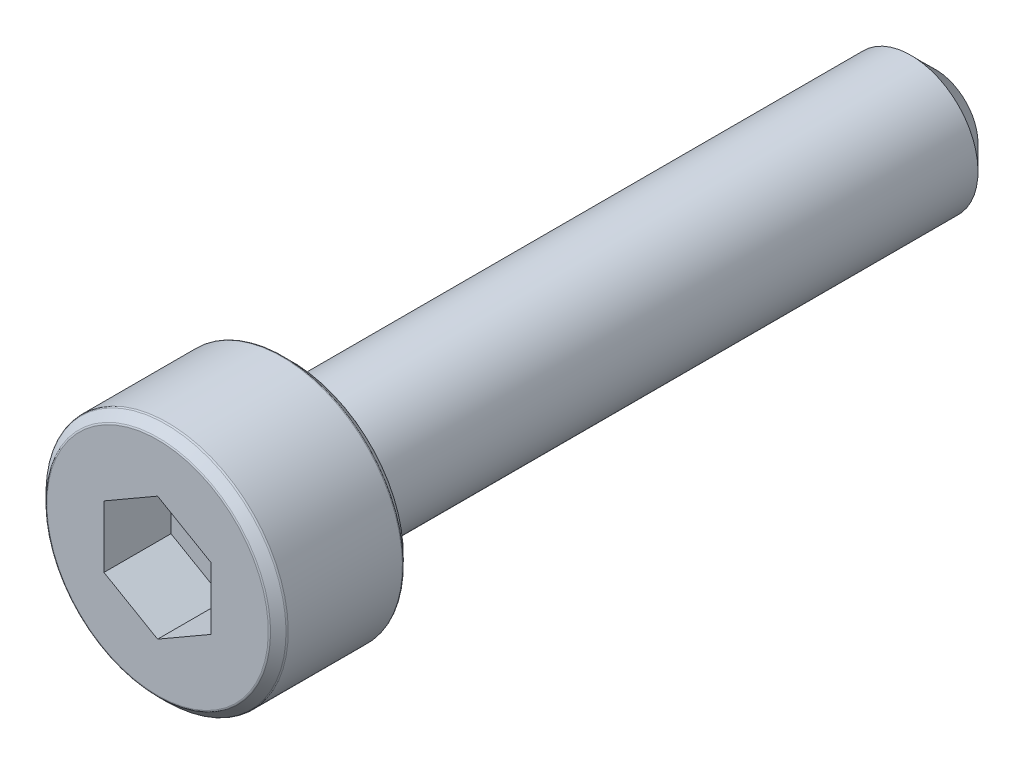
ISO-10303-21;
HEADER;
FILE_DESCRIPTION(('STEP AP214'),'2;1');
FILE_NAME('part.step','',(''),(''),'','','');
FILE_SCHEMA(('AUTOMOTIVE_DESIGN { 1 0 10303 214 1 1 1 1 }'));
ENDSEC;
DATA;
#1=APPLICATION_CONTEXT('core data for automotive mechanical design processes');
#2=APPLICATION_PROTOCOL_DEFINITION('international standard','automotive_design',2000,#1);
#3=PRODUCT_CONTEXT('',#1,'mechanical');
#4=PRODUCT('Part','Part','',(#3));
#5=PRODUCT_RELATED_PRODUCT_CATEGORY('part','',(#4));
#6=PRODUCT_DEFINITION_FORMATION('','',#4);
#7=PRODUCT_DEFINITION_CONTEXT('part definition',#1,'design');
#8=PRODUCT_DEFINITION('design','',#6,#7);
#9=PRODUCT_DEFINITION_SHAPE('','',#8);
#10=(LENGTH_UNIT() NAMED_UNIT(*) SI_UNIT(.MILLI.,.METRE.));
#11=(NAMED_UNIT(*) PLANE_ANGLE_UNIT() SI_UNIT($,.RADIAN.));
#12=(NAMED_UNIT(*) SI_UNIT($,.STERADIAN.) SOLID_ANGLE_UNIT());
#13=UNCERTAINTY_MEASURE_WITH_UNIT(LENGTH_MEASURE(1.E-05),#10,'distance_accuracy_value','');
#14=(GEOMETRIC_REPRESENTATION_CONTEXT(3) GLOBAL_UNCERTAINTY_ASSIGNED_CONTEXT((#13)) GLOBAL_UNIT_ASSIGNED_CONTEXT((#10,
#11,#12)) REPRESENTATION_CONTEXT('',''));
#15=CARTESIAN_POINT('',(0.,0.,0.));
#16=DIRECTION('',(0.,0.,1.));
#17=DIRECTION('',(1.,0.,0.));
#18=AXIS2_PLACEMENT_3D('',#15,#16,#17);
#19=CARTESIAN_POINT('',(0.,2.06377536533739,7.25));
#20=DIRECTION('',(0.,0.,-1.));
#21=DIRECTION('',(0.,1.,0.));
#22=AXIS2_PLACEMENT_3D('',#19,#20,#21);
#23=PLANE('',#22);
#24=DIRECTION('',(-0.866025403784439,-0.5,0.));
#25=VECTOR('',#24,1.);
#26=CARTESIAN_POINT('',(0.,1.15470053837925,7.25));
#27=LINE('',#26,#25);
#28=CARTESIAN_POINT('',(0.,1.15470053837925,7.25));
#29=VERTEX_POINT('',#28);
#30=CARTESIAN_POINT('',(-0.999999999999996,0.577350269189628,7.25));
#31=VERTEX_POINT('',#30);
#32=EDGE_CURVE('E53',#29,#31,#27,.T.);
#33=ORIENTED_EDGE('',*,*,#32,.F.);
#34=DIRECTION('',(-0.866025403784439,0.5,0.));
#35=VECTOR('',#34,1.);
#36=CARTESIAN_POINT('',(0.999999999999996,0.577350269189628,7.25));
#37=LINE('',#36,#35);
#38=CARTESIAN_POINT('',(0.999999999999996,0.577350269189628,7.25));
#39=VERTEX_POINT('',#38);
#40=EDGE_CURVE('E83',#39,#29,#37,.T.);
#41=ORIENTED_EDGE('',*,*,#40,.F.);
#42=DIRECTION('',(0.,1.,0.));
#43=VECTOR('',#42,1.);
#44=CARTESIAN_POINT('',(0.999999999999996,-0.57735026918962,7.25));
#45=LINE('',#44,#43);
#46=CARTESIAN_POINT('',(0.999999999999996,-0.57735026918962,7.25));
#47=VERTEX_POINT('',#46);
#48=EDGE_CURVE('E408',#47,#39,#45,.T.);
#49=ORIENTED_EDGE('',*,*,#48,.F.);
#50=DIRECTION('',(0.866025403784439,0.5,0.));
#51=VECTOR('',#50,1.);
#52=CARTESIAN_POINT('',(0.,-1.15470053837924,7.25));
#53=LINE('',#52,#51);
#54=CARTESIAN_POINT('',(0.,-1.15470053837924,7.25));
#55=VERTEX_POINT('',#54);
#56=EDGE_CURVE('E415',#55,#47,#53,.T.);
#57=ORIENTED_EDGE('',*,*,#56,.F.);
#58=DIRECTION('',(0.866025403784439,-0.5,0.));
#59=VECTOR('',#58,1.);
#60=CARTESIAN_POINT('',(-0.999999999999995,-0.57735026918962,7.25));
#61=LINE('',#60,#59);
#62=CARTESIAN_POINT('',(-0.999999999999995,-0.57735026918962,7.25));
#63=VERTEX_POINT('',#62);
#64=EDGE_CURVE('E122',#63,#55,#61,.T.);
#65=ORIENTED_EDGE('',*,*,#64,.F.);
#66=DIRECTION('',(0.,-1.,0.));
#67=VECTOR('',#66,1.);
#68=CARTESIAN_POINT('',(-0.999999999999996,0.577350269189628,7.25));
#69=LINE('',#68,#67);
#70=EDGE_CURVE('E403',#31,#63,#69,.T.);
#71=ORIENTED_EDGE('',*,*,#70,.F.);
#72=EDGE_LOOP('',(#33,#41,#49,#57,#65,#71));
#73=FACE_BOUND('',#72,.T.);
#74=CARTESIAN_POINT('',(0.,0.,7.25));
#75=DIRECTION('',(0.,0.,1.));
#76=DIRECTION('',(0.,-1.,0.));
#77=AXIS2_PLACEMENT_3D('',#74,#75,#76);
#78=CIRCLE('',#77,2.06377536533738);
#79=CARTESIAN_POINT('',(0.,-2.06377536533738,7.25));
#80=VERTEX_POINT('',#79);
#81=EDGE_CURVE('E11',#80,#80,#78,.T.);
#82=ORIENTED_EDGE('',*,*,#81,.T.);
#83=EDGE_LOOP('',(#82));
#84=FACE_BOUND('',#83,.T.);
#85=ADVANCED_FACE('F39',(#73,#84),#23,.F.);
#86=CARTESIAN_POINT('',(0.,0.,7.2078125));
#87=DIRECTION('',(0.,0.,1.));
#88=DIRECTION('',(0.,-1.,0.));
#89=AXIS2_PLACEMENT_3D('',#86,#87,#88);
#90=TOROIDAL_SURFACE('',#89,2.06377536533738,0.0421874999999995);
#91=ORIENTED_EDGE('',*,*,#81,.F.);
#92=EDGE_LOOP('',(#91));
#93=FACE_BOUND('',#92,.T.);
#94=CARTESIAN_POINT('',(0.,0.,7.23764356733131));
#95=DIRECTION('',(0.,0.,1.));
#96=DIRECTION('',(0.,-1.,0.));
#97=AXIS2_PLACEMENT_3D('',#94,#95,#96);
#98=CIRCLE('',#97,2.09360643266869);
#99=CARTESIAN_POINT('',(0.,-2.09360643266869,7.23764356733131));
#100=VERTEX_POINT('',#99);
#101=EDGE_CURVE('E46',#100,#100,#98,.T.);
#102=ORIENTED_EDGE('',*,*,#101,.T.);
#103=EDGE_LOOP('',(#102));
#104=FACE_BOUND('',#103,.T.);
#105=ADVANCED_FACE('F164',(#93,#104),#90,.T.);
#106=CARTESIAN_POINT('',(0.,0.,7.09360643266869));
#107=DIRECTION('',(0.,0.,-1.));
#108=DIRECTION('',(0.,1.,0.));
#109=AXIS2_PLACEMENT_3D('',#106,#107,#108);
#110=CONICAL_SURFACE('',#109,2.23764356733131,0.785398163397448);
#111=ORIENTED_EDGE('',*,*,#101,.F.);
#112=EDGE_LOOP('',(#111));
#113=FACE_BOUND('',#112,.T.);
#114=CARTESIAN_POINT('',(0.,0.,7.09360643266869));
#115=DIRECTION('',(0.,0.,1.));
#116=DIRECTION('',(0.,-1.,0.));
#117=AXIS2_PLACEMENT_3D('',#114,#115,#116);
#118=CIRCLE('',#117,2.23764356733131);
#119=CARTESIAN_POINT('',(0.,-2.23764356733131,7.09360643266869));
#120=VERTEX_POINT('',#119);
#121=EDGE_CURVE('E159',#120,#120,#118,.T.);
#122=ORIENTED_EDGE('',*,*,#121,.T.);
#123=EDGE_LOOP('',(#122));
#124=FACE_BOUND('',#123,.T.);
#125=ADVANCED_FACE('F166',(#113,#124),#110,.T.);
#126=CARTESIAN_POINT('',(0.,0.,7.06377536533738));
#127=DIRECTION('',(0.,0.,1.));
#128=DIRECTION('',(0.,-1.,0.));
#129=AXIS2_PLACEMENT_3D('',#126,#127,#128);
#130=TOROIDAL_SURFACE('',#129,2.2078125,0.0421875);
#131=ORIENTED_EDGE('',*,*,#121,.F.);
#132=EDGE_LOOP('',(#131));
#133=FACE_BOUND('',#132,.T.);
#134=CARTESIAN_POINT('',(0.,0.,7.06377536533738));
#135=DIRECTION('',(0.,0.,1.));
#136=DIRECTION('',(0.,-1.,0.));
#137=AXIS2_PLACEMENT_3D('',#134,#135,#136);
#138=CIRCLE('',#137,2.25);
#139=CARTESIAN_POINT('',(0.,-2.25,7.06377536533738));
#140=VERTEX_POINT('',#139);
#141=EDGE_CURVE('E156',#140,#140,#138,.T.);
#142=ORIENTED_EDGE('',*,*,#141,.T.);
#143=EDGE_LOOP('',(#142));
#144=FACE_BOUND('',#143,.T.);
#145=ADVANCED_FACE('F169',(#133,#144),#130,.T.);
#146=CARTESIAN_POINT('',(0.,0.,7.25));
#147=DIRECTION('',(0.,0.,1.));
#148=DIRECTION('',(0.,-1.,0.));
#149=AXIS2_PLACEMENT_3D('',#146,#147,#148);
#150=CYLINDRICAL_SURFACE('',#149,2.25);
#151=ORIENTED_EDGE('',*,*,#141,.F.);
#152=EDGE_LOOP('',(#151));
#153=FACE_BOUND('',#152,.T.);
#154=CARTESIAN_POINT('',(0.,0.,4.93622463466261));
#155=DIRECTION('',(0.,0.,1.));
#156=DIRECTION('',(0.,-1.,0.));
#157=AXIS2_PLACEMENT_3D('',#154,#155,#156);
#158=CIRCLE('',#157,2.25);
#159=CARTESIAN_POINT('',(0.,-2.25,4.93622463466261));
#160=VERTEX_POINT('',#159);
#161=EDGE_CURVE('E153',#160,#160,#158,.T.);
#162=ORIENTED_EDGE('',*,*,#161,.T.);
#163=EDGE_LOOP('',(#162));
#164=FACE_BOUND('',#163,.T.);
#165=ADVANCED_FACE('F175',(#153,#164),#150,.T.);
#166=CARTESIAN_POINT('',(0.,0.,4.93622463466261));
#167=DIRECTION('',(0.,0.,1.));
#168=DIRECTION('',(0.,-1.,0.));
#169=AXIS2_PLACEMENT_3D('',#166,#167,#168);
#170=TOROIDAL_SURFACE('',#169,2.2078125,0.0421874999999995);
#171=ORIENTED_EDGE('',*,*,#161,.F.);
#172=EDGE_LOOP('',(#171));
#173=FACE_BOUND('',#172,.T.);
#174=CARTESIAN_POINT('',(0.,0.,4.90639356733131));
#175=DIRECTION('',(0.,0.,1.));
#176=DIRECTION('',(0.,-1.,0.));
#177=AXIS2_PLACEMENT_3D('',#174,#175,#176);
#178=CIRCLE('',#177,2.23764356733131);
#179=CARTESIAN_POINT('',(0.,-2.23764356733131,4.90639356733131));
#180=VERTEX_POINT('',#179);
#181=EDGE_CURVE('E150',#180,#180,#178,.T.);
#182=ORIENTED_EDGE('',*,*,#181,.T.);
#183=EDGE_LOOP('',(#182));
#184=FACE_BOUND('',#183,.T.);
#185=ADVANCED_FACE('F181',(#173,#184),#170,.T.);
#186=CARTESIAN_POINT('',(0.,0.,4.76235643266869));
#187=DIRECTION('',(0.,0.,1.));
#188=DIRECTION('',(0.,-1.,0.));
#189=AXIS2_PLACEMENT_3D('',#186,#187,#188);
#190=CONICAL_SURFACE('',#189,2.09360643266869,0.785398163397442);
#191=ORIENTED_EDGE('',*,*,#181,.F.);
#192=EDGE_LOOP('',(#191));
#193=FACE_BOUND('',#192,.T.);
#194=CARTESIAN_POINT('',(0.,0.,4.76235643266869));
#195=DIRECTION('',(0.,0.,1.));
#196=DIRECTION('',(0.,-1.,0.));
#197=AXIS2_PLACEMENT_3D('',#194,#195,#196);
#198=CIRCLE('',#197,2.09360643266869);
#199=CARTESIAN_POINT('',(0.,-2.09360643266869,4.76235643266869));
#200=VERTEX_POINT('',#199);
#201=EDGE_CURVE('E147',#200,#200,#198,.T.);
#202=ORIENTED_EDGE('',*,*,#201,.T.);
#203=EDGE_LOOP('',(#202));
#204=FACE_BOUND('',#203,.T.);
#205=ADVANCED_FACE('F187',(#193,#204),#190,.T.);
#206=CARTESIAN_POINT('',(0.,0.,4.7921875));
#207=DIRECTION('',(0.,0.,1.));
#208=DIRECTION('',(0.,-1.,0.));
#209=AXIS2_PLACEMENT_3D('',#206,#207,#208);
#210=TOROIDAL_SURFACE('',#209,2.06377536533739,0.0421874999999998);
#211=ORIENTED_EDGE('',*,*,#201,.F.);
#212=EDGE_LOOP('',(#211));
#213=FACE_BOUND('',#212,.T.);
#214=CARTESIAN_POINT('',(0.,0.,4.75));
#215=DIRECTION('',(0.,0.,1.));
#216=DIRECTION('',(0.,-1.,0.));
#217=AXIS2_PLACEMENT_3D('',#214,#215,#216);
#218=CIRCLE('',#217,2.06377536533739);
#219=CARTESIAN_POINT('',(0.,-2.06377536533739,4.75));
#220=VERTEX_POINT('',#219);
#221=EDGE_CURVE('E144',#220,#220,#218,.T.);
#222=ORIENTED_EDGE('',*,*,#221,.T.);
#223=EDGE_LOOP('',(#222));
#224=FACE_BOUND('',#223,.T.);
#225=ADVANCED_FACE('F193',(#213,#224),#210,.T.);
#226=CARTESIAN_POINT('',(0.,1.25,4.75));
#227=DIRECTION('',(0.,0.,1.));
#228=DIRECTION('',(0.,-1.,0.));
#229=AXIS2_PLACEMENT_3D('',#226,#227,#228);
#230=PLANE('',#229);
#231=ORIENTED_EDGE('',*,*,#221,.F.);
#232=EDGE_LOOP('',(#231));
#233=FACE_BOUND('',#232,.T.);
#234=CARTESIAN_POINT('',(0.,0.,4.75));
#235=DIRECTION('',(0.,0.,1.));
#236=DIRECTION('',(0.,-1.,0.));
#237=AXIS2_PLACEMENT_3D('',#234,#235,#236);
#238=CIRCLE('',#237,1.25);
#239=CARTESIAN_POINT('',(0.,-1.25,4.75));
#240=VERTEX_POINT('',#239);
#241=EDGE_CURVE('E141',#240,#240,#238,.T.);
#242=ORIENTED_EDGE('',*,*,#241,.T.);
#243=EDGE_LOOP('',(#242));
#244=FACE_BOUND('',#243,.T.);
#245=ADVANCED_FACE('F199',(#233,#244),#230,.F.);
#246=CARTESIAN_POINT('',(0.,0.,7.25));
#247=DIRECTION('',(0.,0.,1.));
#248=DIRECTION('',(0.,-1.,0.));
#249=AXIS2_PLACEMENT_3D('',#246,#247,#248);
#250=CYLINDRICAL_SURFACE('',#249,1.25);
#251=ORIENTED_EDGE('',*,*,#241,.F.);
#252=EDGE_LOOP('',(#251));
#253=FACE_BOUND('',#252,.T.);
#254=CARTESIAN_POINT('',(0.,0.,-6.79533666301317));
#255=DIRECTION('',(0.,0.,1.));
#256=DIRECTION('',(0.,-1.,0.));
#257=AXIS2_PLACEMENT_3D('',#254,#255,#256);
#258=CIRCLE('',#257,1.25);
#259=CARTESIAN_POINT('',(0.,-1.25,-6.79533666301317));
#260=VERTEX_POINT('',#259);
#261=EDGE_CURVE('E138',#260,#260,#258,.T.);
#262=ORIENTED_EDGE('',*,*,#261,.T.);
#263=EDGE_LOOP('',(#262));
#264=FACE_BOUND('',#263,.T.);
#265=ADVANCED_FACE('F205',(#253,#264),#250,.T.);
#266=CARTESIAN_POINT('',(0.,0.,-7.25));
#267=DIRECTION('',(0.,0.,1.));
#268=DIRECTION('',(0.,-1.,0.));
#269=AXIS2_PLACEMENT_3D('',#266,#267,#268);
#270=CONICAL_SURFACE('',#269,0.795336663013164,0.785398163397452);
#271=ORIENTED_EDGE('',*,*,#261,.F.);
#272=EDGE_LOOP('',(#271));
#273=FACE_BOUND('',#272,.T.);
#274=CARTESIAN_POINT('',(0.,0.,-7.25));
#275=DIRECTION('',(0.,0.,1.));
#276=DIRECTION('',(0.,-1.,0.));
#277=AXIS2_PLACEMENT_3D('',#274,#275,#276);
#278=CIRCLE('',#277,0.795336663013164);
#279=CARTESIAN_POINT('',(0.,-0.795336663013163,-7.25));
#280=VERTEX_POINT('',#279);
#281=EDGE_CURVE('E135',#280,#280,#278,.T.);
#282=ORIENTED_EDGE('',*,*,#281,.T.);
#283=EDGE_LOOP('',(#282));
#284=FACE_BOUND('',#283,.T.);
#285=ADVANCED_FACE('F211',(#273,#284),#270,.T.);
#286=CARTESIAN_POINT('',(0.,0.,-7.25));
#287=DIRECTION('',(0.,0.,1.));
#288=DIRECTION('',(0.,-1.,0.));
#289=AXIS2_PLACEMENT_3D('',#286,#287,#288);
#290=PLANE('',#289);
#291=ORIENTED_EDGE('',*,*,#281,.F.);
#292=EDGE_LOOP('',(#291));
#293=FACE_BOUND('',#292,.T.);
#294=ADVANCED_FACE('F217',(#293),#290,.F.);
#295=CARTESIAN_POINT('',(0.999999999999996,0.577350269189628,6.));
#296=DIRECTION('',(0.5,0.866025403784439,0.));
#297=DIRECTION('',(-0.866025403784439,0.5,0.));
#298=AXIS2_PLACEMENT_3D('',#295,#296,#297);
#299=PLANE('',#298);
#300=ORIENTED_EDGE('',*,*,#40,.T.);
#301=DIRECTION('',(0.,0.,1.));
#302=VECTOR('',#301,1.);
#303=CARTESIAN_POINT('',(0.,1.15470053837925,6.));
#304=LINE('',#303,#302);
#305=CARTESIAN_POINT('',(0.,1.15470053837925,6.));
#306=VERTEX_POINT('',#305);
#307=EDGE_CURVE('E133',#306,#29,#304,.T.);
#308=ORIENTED_EDGE('',*,*,#307,.F.);
#309=DIRECTION('',(-0.866025403784439,0.5,0.));
#310=VECTOR('',#309,1.);
#311=CARTESIAN_POINT('',(0.999999999999996,0.577350269189628,6.));
#312=LINE('',#311,#310);
#313=CARTESIAN_POINT('',(0.999999999999996,0.577350269189628,6.));
#314=VERTEX_POINT('',#313);
#315=EDGE_CURVE('E62',#314,#306,#312,.T.);
#316=ORIENTED_EDGE('',*,*,#315,.F.);
#317=DIRECTION('',(0.,0.,1.));
#318=VECTOR('',#317,1.);
#319=CARTESIAN_POINT('',(0.999999999999996,0.577350269189628,6.));
#320=LINE('',#319,#318);
#321=EDGE_CURVE('E125',#314,#39,#320,.T.);
#322=ORIENTED_EDGE('',*,*,#321,.T.);
#323=EDGE_LOOP('',(#300,#308,#316,#322));
#324=FACE_BOUND('',#323,.T.);
#325=ADVANCED_FACE('F222',(#324),#299,.F.);
#326=CARTESIAN_POINT('',(0.999999999999996,-0.57735026918962,6.));
#327=DIRECTION('',(1.,0.,0.));
#328=DIRECTION('',(0.,1.,0.));
#329=AXIS2_PLACEMENT_3D('',#326,#327,#328);
#330=PLANE('',#329);
#331=ORIENTED_EDGE('',*,*,#48,.T.);
#332=ORIENTED_EDGE('',*,*,#321,.F.);
#333=DIRECTION('',(0.,1.,0.));
#334=VECTOR('',#333,1.);
#335=CARTESIAN_POINT('',(0.999999999999996,-0.57735026918962,6.));
#336=LINE('',#335,#334);
#337=CARTESIAN_POINT('',(0.999999999999996,-0.57735026918962,6.));
#338=VERTEX_POINT('',#337);
#339=EDGE_CURVE('E110',#338,#314,#336,.T.);
#340=ORIENTED_EDGE('',*,*,#339,.F.);
#341=DIRECTION('',(0.,0.,1.));
#342=VECTOR('',#341,1.);
#343=CARTESIAN_POINT('',(0.999999999999996,-0.57735026918962,6.));
#344=LINE('',#343,#342);
#345=EDGE_CURVE('E108',#338,#47,#344,.T.);
#346=ORIENTED_EDGE('',*,*,#345,.T.);
#347=EDGE_LOOP('',(#331,#332,#340,#346));
#348=FACE_BOUND('',#347,.T.);
#349=ADVANCED_FACE('F227',(#348),#330,.F.);
#350=CARTESIAN_POINT('',(0.,-1.15470053837924,6.));
#351=DIRECTION('',(0.5,-0.866025403784439,0.));
#352=DIRECTION('',(0.866025403784439,0.5,0.));
#353=AXIS2_PLACEMENT_3D('',#350,#351,#352);
#354=PLANE('',#353);
#355=ORIENTED_EDGE('',*,*,#56,.T.);
#356=ORIENTED_EDGE('',*,*,#345,.F.);
#357=DIRECTION('',(0.866025403784439,0.5,0.));
#358=VECTOR('',#357,1.);
#359=CARTESIAN_POINT('',(0.,-1.15470053837924,6.));
#360=LINE('',#359,#358);
#361=CARTESIAN_POINT('',(0.,-1.15470053837924,6.));
#362=VERTEX_POINT('',#361);
#363=EDGE_CURVE('E102',#362,#338,#360,.T.);
#364=ORIENTED_EDGE('',*,*,#363,.F.);
#365=DIRECTION('',(0.,0.,1.));
#366=VECTOR('',#365,1.);
#367=CARTESIAN_POINT('',(0.,-1.15470053837924,6.));
#368=LINE('',#367,#366);
#369=EDGE_CURVE('E106',#362,#55,#368,.T.);
#370=ORIENTED_EDGE('',*,*,#369,.T.);
#371=EDGE_LOOP('',(#355,#356,#364,#370));
#372=FACE_BOUND('',#371,.T.);
#373=ADVANCED_FACE('F104',(#372),#354,.F.);
#374=CARTESIAN_POINT('',(-0.999999999999995,-0.57735026918962,6.));
#375=DIRECTION('',(-0.5,-0.866025403784439,0.));
#376=DIRECTION('',(0.866025403784439,-0.5,0.));
#377=AXIS2_PLACEMENT_3D('',#374,#375,#376);
#378=PLANE('',#377);
#379=ORIENTED_EDGE('',*,*,#64,.T.);
#380=ORIENTED_EDGE('',*,*,#369,.F.);
#381=DIRECTION('',(0.866025403784439,-0.5,0.));
#382=VECTOR('',#381,1.);
#383=CARTESIAN_POINT('',(-0.999999999999995,-0.57735026918962,6.));
#384=LINE('',#383,#382);
#385=CARTESIAN_POINT('',(-0.999999999999995,-0.57735026918962,6.));
#386=VERTEX_POINT('',#385);
#387=EDGE_CURVE('E111',#386,#362,#384,.T.);
#388=ORIENTED_EDGE('',*,*,#387,.F.);
#389=DIRECTION('',(0.,0.,1.));
#390=VECTOR('',#389,1.);
#391=CARTESIAN_POINT('',(-0.999999999999995,-0.57735026918962,6.));
#392=LINE('',#391,#390);
#393=EDGE_CURVE('E123',#386,#63,#392,.T.);
#394=ORIENTED_EDGE('',*,*,#393,.T.);
#395=EDGE_LOOP('',(#379,#380,#388,#394));
#396=FACE_BOUND('',#395,.T.);
#397=ADVANCED_FACE('F121',(#396),#378,.F.);
#398=CARTESIAN_POINT('',(-0.999999999999996,0.577350269189628,6.));
#399=DIRECTION('',(-1.,0.,0.));
#400=DIRECTION('',(0.,-1.,0.));
#401=AXIS2_PLACEMENT_3D('',#398,#399,#400);
#402=PLANE('',#401);
#403=ORIENTED_EDGE('',*,*,#70,.T.);
#404=ORIENTED_EDGE('',*,*,#393,.F.);
#405=DIRECTION('',(0.,-1.,0.));
#406=VECTOR('',#405,1.);
#407=CARTESIAN_POINT('',(-0.999999999999996,0.577350269189628,6.));
#408=LINE('',#407,#406);
#409=CARTESIAN_POINT('',(-0.999999999999996,0.577350269189628,6.));
#410=VERTEX_POINT('',#409);
#411=EDGE_CURVE('E115',#410,#386,#408,.T.);
#412=ORIENTED_EDGE('',*,*,#411,.F.);
#413=DIRECTION('',(0.,0.,1.));
#414=VECTOR('',#413,1.);
#415=CARTESIAN_POINT('',(-0.999999999999996,0.577350269189628,6.));
#416=LINE('',#415,#414);
#417=EDGE_CURVE('E127',#410,#31,#416,.T.);
#418=ORIENTED_EDGE('',*,*,#417,.T.);
#419=EDGE_LOOP('',(#403,#404,#412,#418));
#420=FACE_BOUND('',#419,.T.);
#421=ADVANCED_FACE('F322',(#420),#402,.F.);
#422=CARTESIAN_POINT('',(0.,1.15470053837925,6.));
#423=DIRECTION('',(-0.5,0.866025403784439,0.));
#424=DIRECTION('',(-0.866025403784439,-0.5,0.));
#425=AXIS2_PLACEMENT_3D('',#422,#423,#424);
#426=PLANE('',#425);
#427=ORIENTED_EDGE('',*,*,#32,.T.);
#428=ORIENTED_EDGE('',*,*,#417,.F.);
#429=DIRECTION('',(-0.866025403784439,-0.5,0.));
#430=VECTOR('',#429,1.);
#431=CARTESIAN_POINT('',(0.,1.15470053837925,6.));
#432=LINE('',#431,#430);
#433=EDGE_CURVE('E91',#306,#410,#432,.T.);
#434=ORIENTED_EDGE('',*,*,#433,.F.);
#435=ORIENTED_EDGE('',*,*,#307,.T.);
#436=EDGE_LOOP('',(#427,#428,#434,#435));
#437=FACE_BOUND('',#436,.T.);
#438=ADVANCED_FACE('F332',(#437),#426,.F.);
#439=CARTESIAN_POINT('',(0.,1.,6.));
#440=DIRECTION('',(0.,0.,-1.));
#441=DIRECTION('',(0.,1.,0.));
#442=AXIS2_PLACEMENT_3D('',#439,#440,#441);
#443=PLANE('',#442);
#444=ORIENTED_EDGE('',*,*,#387,.T.);
#445=ORIENTED_EDGE('',*,*,#363,.T.);
#446=ORIENTED_EDGE('',*,*,#339,.T.);
#447=ORIENTED_EDGE('',*,*,#315,.T.);
#448=ORIENTED_EDGE('',*,*,#433,.T.);
#449=ORIENTED_EDGE('',*,*,#411,.T.);
#450=EDGE_LOOP('',(#444,#445,#446,#447,#448,#449));
#451=FACE_BOUND('',#450,.T.);
#452=ADVANCED_FACE('F114',(#451),#443,.F.);
#453=CLOSED_SHELL('',(#85,#105,#125,#145,#165,#185,#205,#225,#245,#265,#285,#294,#325,#349,#373,
#397,#421,#438,#452));
#454=MANIFOLD_SOLID_BREP('B2',#453);
#455=ADVANCED_BREP_SHAPE_REPRESENTATION('',(#18,#454),#14);
#456=SHAPE_DEFINITION_REPRESENTATION(#9,#455);
ENDSEC;
END-ISO-10303-21;
